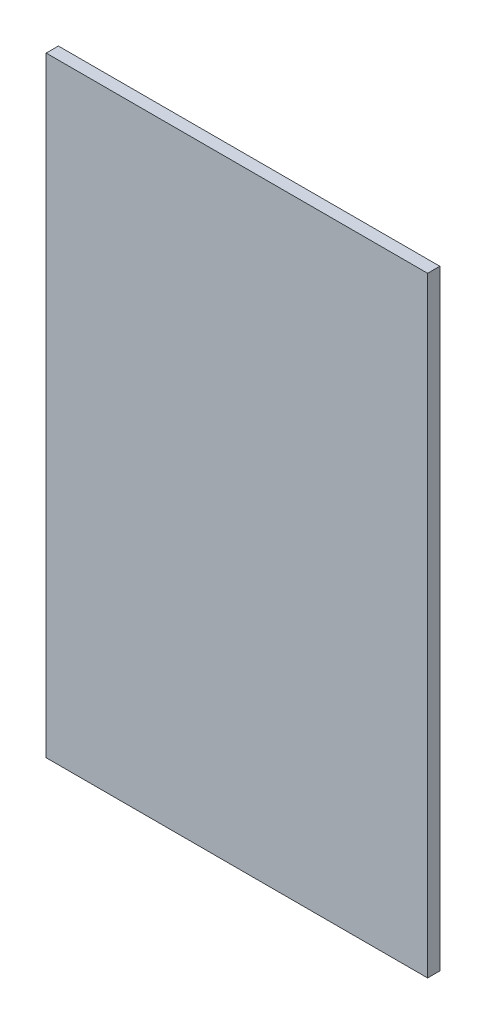
ISO-10303-21;
HEADER;
FILE_DESCRIPTION(('STEP AP214'),'2;1');
FILE_NAME('part.step','',(''),(''),'','','');
FILE_SCHEMA(('AUTOMOTIVE_DESIGN { 1 0 10303 214 1 1 1 1 }'));
ENDSEC;
DATA;
#1=APPLICATION_CONTEXT('core data for automotive mechanical design processes');
#2=APPLICATION_PROTOCOL_DEFINITION('international standard','automotive_design',2000,#1);
#3=PRODUCT_CONTEXT('',#1,'mechanical');
#4=PRODUCT('Part','Part','',(#3));
#5=PRODUCT_RELATED_PRODUCT_CATEGORY('part','',(#4));
#6=PRODUCT_DEFINITION_FORMATION('','',#4);
#7=PRODUCT_DEFINITION_CONTEXT('part definition',#1,'design');
#8=PRODUCT_DEFINITION('design','',#6,#7);
#9=PRODUCT_DEFINITION_SHAPE('','',#8);
#10=(LENGTH_UNIT() NAMED_UNIT(*) SI_UNIT(.MILLI.,.METRE.));
#11=(NAMED_UNIT(*) PLANE_ANGLE_UNIT() SI_UNIT($,.RADIAN.));
#12=(NAMED_UNIT(*) SI_UNIT($,.STERADIAN.) SOLID_ANGLE_UNIT());
#13=UNCERTAINTY_MEASURE_WITH_UNIT(LENGTH_MEASURE(1.E-05),#10,'distance_accuracy_value','');
#14=(GEOMETRIC_REPRESENTATION_CONTEXT(3) GLOBAL_UNCERTAINTY_ASSIGNED_CONTEXT((#13)) GLOBAL_UNIT_ASSIGNED_CONTEXT((#10,
#11,#12)) REPRESENTATION_CONTEXT('',''));
#15=CARTESIAN_POINT('',(0.,0.,0.));
#16=DIRECTION('',(0.,0.,1.));
#17=DIRECTION('',(1.,0.,0.));
#18=AXIS2_PLACEMENT_3D('',#15,#16,#17);
#19=CARTESIAN_POINT('',(-90.7670115646134,-2.48065923548779,0.8));
#20=DIRECTION('',(1.,0.,0.));
#21=DIRECTION('',(0.,0.,-1.));
#22=AXIS2_PLACEMENT_3D('',#19,#20,#21);
#23=PLANE('',#22);
#24=DIRECTION('',(0.,-1.,0.));
#25=VECTOR('',#24,1.);
#26=CARTESIAN_POINT('',(-90.7670115646134,-2.48065923548779,0.));
#27=LINE('',#26,#25);
#28=CARTESIAN_POINT('',(-90.7670115646134,-2.48065923548779,0.));
#29=VERTEX_POINT('',#28);
#30=CARTESIAN_POINT('',(-90.7670115646134,-42.4806592354878,0.));
#31=VERTEX_POINT('',#30);
#32=EDGE_CURVE('E95',#29,#31,#27,.T.);
#33=ORIENTED_EDGE('',*,*,#32,.T.);
#34=DIRECTION('',(0.,0.,-1.));
#35=VECTOR('',#34,1.);
#36=CARTESIAN_POINT('',(-90.7670115646134,-42.4806592354878,0.8));
#37=LINE('',#36,#35);
#38=CARTESIAN_POINT('',(-90.7670115646134,-42.4806592354878,0.8));
#39=VERTEX_POINT('',#38);
#40=EDGE_CURVE('E11',#39,#31,#37,.T.);
#41=ORIENTED_EDGE('',*,*,#40,.F.);
#42=DIRECTION('',(0.,-1.,0.));
#43=VECTOR('',#42,1.);
#44=CARTESIAN_POINT('',(-90.7670115646134,-2.48065923548779,0.8));
#45=LINE('',#44,#43);
#46=CARTESIAN_POINT('',(-90.7670115646134,-2.48065923548779,0.8));
#47=VERTEX_POINT('',#46);
#48=EDGE_CURVE('E83',#47,#39,#45,.T.);
#49=ORIENTED_EDGE('',*,*,#48,.F.);
#50=DIRECTION('',(0.,0.,-1.));
#51=VECTOR('',#50,1.);
#52=CARTESIAN_POINT('',(-90.7670115646134,-2.48065923548779,0.8));
#53=LINE('',#52,#51);
#54=EDGE_CURVE('E91',#47,#29,#53,.T.);
#55=ORIENTED_EDGE('',*,*,#54,.T.);
#56=EDGE_LOOP('',(#33,#41,#49,#55));
#57=FACE_BOUND('',#56,.T.);
#58=ADVANCED_FACE('F32',(#57),#23,.F.);
#59=CARTESIAN_POINT('',(-90.7670115646134,-42.4806592354878,0.8));
#60=DIRECTION('',(0.,1.,0.));
#61=DIRECTION('',(0.,0.,1.));
#62=AXIS2_PLACEMENT_3D('',#59,#60,#61);
#63=PLANE('',#62);
#64=DIRECTION('',(1.,0.,0.));
#65=VECTOR('',#64,1.);
#66=CARTESIAN_POINT('',(-90.7670115646134,-42.4806592354878,0.));
#67=LINE('',#66,#65);
#68=CARTESIAN_POINT('',(-65.7670115646134,-42.4806592354878,0.));
#69=VERTEX_POINT('',#68);
#70=EDGE_CURVE('E87',#31,#69,#67,.T.);
#71=ORIENTED_EDGE('',*,*,#70,.T.);
#72=DIRECTION('',(0.,0.,-1.));
#73=VECTOR('',#72,1.);
#74=CARTESIAN_POINT('',(-65.7670115646134,-42.4806592354878,0.8));
#75=LINE('',#74,#73);
#76=CARTESIAN_POINT('',(-65.7670115646134,-42.4806592354878,0.8));
#77=VERTEX_POINT('',#76);
#78=EDGE_CURVE('E40',#77,#69,#75,.T.);
#79=ORIENTED_EDGE('',*,*,#78,.F.);
#80=DIRECTION('',(1.,0.,0.));
#81=VECTOR('',#80,1.);
#82=CARTESIAN_POINT('',(-90.7670115646134,-42.4806592354878,0.8));
#83=LINE('',#82,#81);
#84=EDGE_CURVE('E78',#39,#77,#83,.T.);
#85=ORIENTED_EDGE('',*,*,#84,.F.);
#86=ORIENTED_EDGE('',*,*,#40,.T.);
#87=EDGE_LOOP('',(#71,#79,#85,#86));
#88=FACE_BOUND('',#87,.T.);
#89=ADVANCED_FACE('F86',(#88),#63,.F.);
#90=CARTESIAN_POINT('',(-65.7670115646134,-2.48065923548779,0.8));
#91=DIRECTION('',(-1.,0.,0.));
#92=DIRECTION('',(0.,0.,1.));
#93=AXIS2_PLACEMENT_3D('',#90,#91,#92);
#94=PLANE('',#93);
#95=DIRECTION('',(0.,1.,0.));
#96=VECTOR('',#95,1.);
#97=CARTESIAN_POINT('',(-65.7670115646134,-2.48065923548779,0.));
#98=LINE('',#97,#96);
#99=CARTESIAN_POINT('',(-65.7670115646134,-2.48065923548779,0.));
#100=VERTEX_POINT('',#99);
#101=EDGE_CURVE('E65',#69,#100,#98,.T.);
#102=ORIENTED_EDGE('',*,*,#101,.T.);
#103=DIRECTION('',(0.,0.,-1.));
#104=VECTOR('',#103,1.);
#105=CARTESIAN_POINT('',(-65.7670115646134,-2.48065923548779,0.8));
#106=LINE('',#105,#104);
#107=CARTESIAN_POINT('',(-65.7670115646134,-2.48065923548779,0.8));
#108=VERTEX_POINT('',#107);
#109=EDGE_CURVE('E88',#108,#100,#106,.T.);
#110=ORIENTED_EDGE('',*,*,#109,.F.);
#111=DIRECTION('',(0.,1.,0.));
#112=VECTOR('',#111,1.);
#113=CARTESIAN_POINT('',(-65.7670115646134,-2.48065923548779,0.8));
#114=LINE('',#113,#112);
#115=EDGE_CURVE('E81',#77,#108,#114,.T.);
#116=ORIENTED_EDGE('',*,*,#115,.F.);
#117=ORIENTED_EDGE('',*,*,#78,.T.);
#118=EDGE_LOOP('',(#102,#110,#116,#117));
#119=FACE_BOUND('',#118,.T.);
#120=ADVANCED_FACE('F89',(#119),#94,.F.);
#121=CARTESIAN_POINT('',(-90.7670115646134,-2.48065923548779,0.8));
#122=DIRECTION('',(0.,-1.,0.));
#123=DIRECTION('',(0.,0.,-1.));
#124=AXIS2_PLACEMENT_3D('',#121,#122,#123);
#125=PLANE('',#124);
#126=DIRECTION('',(-1.,0.,0.));
#127=VECTOR('',#126,1.);
#128=CARTESIAN_POINT('',(-90.7670115646134,-2.48065923548779,0.));
#129=LINE('',#128,#127);
#130=EDGE_CURVE('E71',#100,#29,#129,.T.);
#131=ORIENTED_EDGE('',*,*,#130,.T.);
#132=ORIENTED_EDGE('',*,*,#54,.F.);
#133=DIRECTION('',(-1.,0.,0.));
#134=VECTOR('',#133,1.);
#135=CARTESIAN_POINT('',(-90.7670115646134,-2.48065923548779,0.8));
#136=LINE('',#135,#134);
#137=EDGE_CURVE('E48',#108,#47,#136,.T.);
#138=ORIENTED_EDGE('',*,*,#137,.F.);
#139=ORIENTED_EDGE('',*,*,#109,.T.);
#140=EDGE_LOOP('',(#131,#132,#138,#139));
#141=FACE_BOUND('',#140,.T.);
#142=ADVANCED_FACE('F102',(#141),#125,.F.);
#143=CARTESIAN_POINT('',(0.,0.,0.8));
#144=DIRECTION('',(0.,0.,1.));
#145=DIRECTION('',(1.,0.,0.));
#146=AXIS2_PLACEMENT_3D('',#143,#144,#145);
#147=PLANE('',#146);
#148=ORIENTED_EDGE('',*,*,#48,.T.);
#149=ORIENTED_EDGE('',*,*,#84,.T.);
#150=ORIENTED_EDGE('',*,*,#115,.T.);
#151=ORIENTED_EDGE('',*,*,#137,.T.);
#152=EDGE_LOOP('',(#148,#149,#150,#151));
#153=FACE_BOUND('',#152,.T.);
#154=ADVANCED_FACE('F79',(#153),#147,.T.);
#155=CARTESIAN_POINT('',(0.,0.,0.));
#156=DIRECTION('',(0.,0.,1.));
#157=DIRECTION('',(1.,0.,0.));
#158=AXIS2_PLACEMENT_3D('',#155,#156,#157);
#159=PLANE('',#158);
#160=ORIENTED_EDGE('',*,*,#32,.F.);
#161=ORIENTED_EDGE('',*,*,#130,.F.);
#162=ORIENTED_EDGE('',*,*,#101,.F.);
#163=ORIENTED_EDGE('',*,*,#70,.F.);
#164=EDGE_LOOP('',(#160,#161,#162,#163));
#165=FACE_BOUND('',#164,.T.);
#166=ADVANCED_FACE('F105',(#165),#159,.F.);
#167=CLOSED_SHELL('',(#58,#89,#120,#142,#154,#166));
#168=MANIFOLD_SOLID_BREP('B2',#167);
#169=ADVANCED_BREP_SHAPE_REPRESENTATION('',(#18,#168),#14);
#170=SHAPE_DEFINITION_REPRESENTATION(#9,#169);
ENDSEC;
END-ISO-10303-21;
